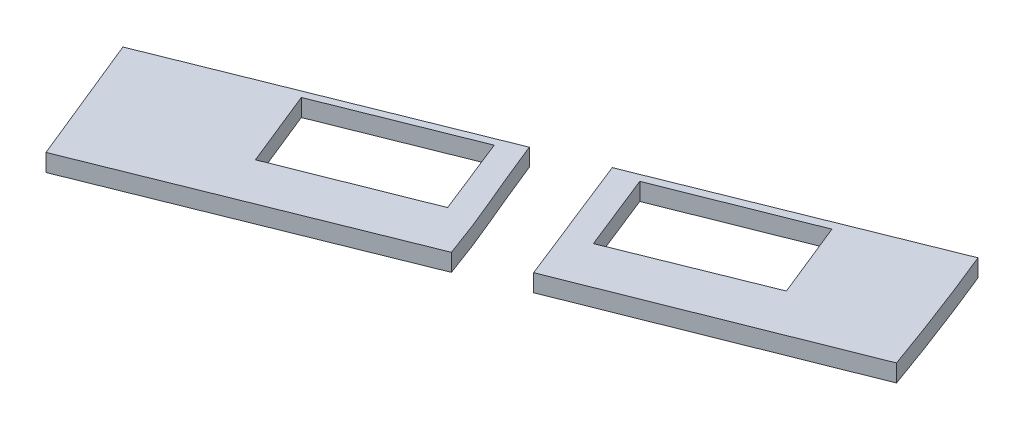
ISO-10303-21;
HEADER;
FILE_DESCRIPTION(('STEP AP214'),'2;1');
FILE_NAME('part.step','',(''),(''),'','','');
FILE_SCHEMA(('AUTOMOTIVE_DESIGN { 1 0 10303 214 1 1 1 1 }'));
ENDSEC;
DATA;
#1=APPLICATION_CONTEXT('core data for automotive mechanical design processes');
#2=APPLICATION_PROTOCOL_DEFINITION('international standard','automotive_design',2000,#1);
#3=PRODUCT_CONTEXT('',#1,'mechanical');
#4=PRODUCT('Part','Part','',(#3));
#5=PRODUCT_RELATED_PRODUCT_CATEGORY('part','',(#4));
#6=PRODUCT_DEFINITION_FORMATION('','',#4);
#7=PRODUCT_DEFINITION_CONTEXT('part definition',#1,'design');
#8=PRODUCT_DEFINITION('design','',#6,#7);
#9=PRODUCT_DEFINITION_SHAPE('','',#8);
#10=(LENGTH_UNIT() NAMED_UNIT(*) SI_UNIT(.MILLI.,.METRE.));
#11=(NAMED_UNIT(*) PLANE_ANGLE_UNIT() SI_UNIT($,.RADIAN.));
#12=(NAMED_UNIT(*) SI_UNIT($,.STERADIAN.) SOLID_ANGLE_UNIT());
#13=UNCERTAINTY_MEASURE_WITH_UNIT(LENGTH_MEASURE(1.E-05),#10,'distance_accuracy_value','');
#14=(GEOMETRIC_REPRESENTATION_CONTEXT(3) GLOBAL_UNCERTAINTY_ASSIGNED_CONTEXT((#13)) GLOBAL_UNIT_ASSIGNED_CONTEXT((#10,
#11,#12)) REPRESENTATION_CONTEXT('',''));
#15=CARTESIAN_POINT('',(0.,0.,0.));
#16=DIRECTION('',(0.,0.,1.));
#17=DIRECTION('',(1.,0.,0.));
#18=AXIS2_PLACEMENT_3D('',#15,#16,#17);
#19=CARTESIAN_POINT('',(35.9788581902602,1.19,-26.9467232131162));
#20=DIRECTION('',(0.,-1.,0.));
#21=DIRECTION('',(0.,0.,-1.));
#22=AXIS2_PLACEMENT_3D('',#19,#20,#21);
#23=PLANE('',#22);
#24=DIRECTION('',(-0.929138932775586,0.,0.369730771779472));
#25=VECTOR('',#24,1.);
#26=CARTESIAN_POINT('',(24.8826001834326,1.19,-16.1536096345668));
#27=LINE('',#26,#25);
#28=CARTESIAN_POINT('',(32.786623966637,1.19,-19.2988451966992));
#29=VERTEX_POINT('',#28);
#30=CARTESIAN_POINT('',(24.8826001834326,1.19,-16.1536096345668));
#31=VERTEX_POINT('',#30);
#32=EDGE_CURVE('E132',#29,#31,#27,.T.);
#33=ORIENTED_EDGE('',*,*,#32,.F.);
#34=DIRECTION('',(-0.374554351369243,0.,-0.927204960011737));
#35=VECTOR('',#34,1.);
#36=CARTESIAN_POINT('',(32.786623966637,1.19,-19.2988451966992));
#37=LINE('',#36,#35);
#38=CARTESIAN_POINT('',(34.559807217706,1.19,-14.9093505895999));
#39=VERTEX_POINT('',#38);
#40=EDGE_CURVE('E206',#39,#29,#37,.T.);
#41=ORIENTED_EDGE('',*,*,#40,.F.);
#42=DIRECTION('',(0.927574779548119,0.,-0.3736375628149));
#43=VECTOR('',#42,1.);
#44=CARTESIAN_POINT('',(34.559807217706,1.19,-14.9093505895999));
#45=LINE('',#44,#43);
#46=CARTESIAN_POINT('',(26.6479258883437,1.19,-11.7223557269067));
#47=VERTEX_POINT('',#46);
#48=EDGE_CURVE('E213',#47,#39,#45,.T.);
#49=ORIENTED_EDGE('',*,*,#48,.F.);
#50=DIRECTION('',(0.370093426325255,0.,0.928994540237365));
#51=VECTOR('',#50,1.);
#52=CARTESIAN_POINT('',(26.6479258883437,1.19,-11.7223557269067));
#53=LINE('',#52,#51);
#54=EDGE_CURVE('E217',#31,#47,#53,.T.);
#55=ORIENTED_EDGE('',*,*,#54,.F.);
#56=EDGE_LOOP('',(#33,#41,#49,#55));
#57=FACE_BOUND('',#56,.T.);
#58=CARTESIAN_POINT('',(41.3064860387741,1.19,-14.4944209133861));
#59=CARTESIAN_POINT('',(40.4413769049084,1.19,-16.9603625473752));
#60=CARTESIAN_POINT('',(38.8653273947854,1.19,-21.0390813626115));
#61=CARTESIAN_POINT('',(38.2178251849978,1.19,-22.5309199781212));
#62=CARTESIAN_POINT('',(37.5641807720796,1.19,-24.0369101682144));
#63=CARTESIAN_POINT('',(36.7438854848778,1.19,-25.4649666392258));
#64=CARTESIAN_POINT('',(35.9992618023672,1.19,-26.9281115543455));
#65=CARTESIAN_POINT('',(35.9910572987333,1.19,-26.9442329564106));
#66=CARTESIAN_POINT('',(35.9659381842422,1.19,-26.9489216293106));
#67=CARTESIAN_POINT('',(35.9606172707881,1.19,-26.9662103934202));
#68=CARTESIAN_POINT('',(35.7688797215146,1.19,-27.5892059164559));
#69=CARTESIAN_POINT('',(35.6349446760462,1.19,-28.230797201937));
#70=CARTESIAN_POINT('',(35.4100442098563,1.19,-28.8426031269095));
#71=CARTESIAN_POINT('',(35.2164658014839,1.19,-29.3692023785491));
#72=CARTESIAN_POINT('',(34.9423080858761,1.19,-29.8625739139352));
#73=CARTESIAN_POINT('',(34.7084400238859,1.19,-30.3725593074478));
#74=B_SPLINE_CURVE_WITH_KNOTS('',3,(#58,#59,#60,#61,#62,#63,#64,#65,#66,#67,#68,#69,#70,#71,#72,
#73),.UNSPECIFIED.,.F.,.F.,(4,3,3,3,3,4),(0.,1.,2.,3.,4.,5.),.UNSPECIFIED.);
#75=CARTESIAN_POINT('',(41.3064860387741,1.19,-14.4944209133861));
#76=VERTEX_POINT('',#75);
#77=CARTESIAN_POINT('',(38.4122924399624,1.19,-22.0724682633881));
#78=VERTEX_POINT('',#77);
#79=EDGE_CURVE('E140',#76,#78,#74,.T.);
#80=ORIENTED_EDGE('',*,*,#79,.T.);
#81=DIRECTION('',(-0.927983740389584,0.,0.372620688599758));
#82=VECTOR('',#81,1.);
#83=CARTESIAN_POINT('',(38.0021800655158,1.19,-21.9077925813591));
#84=LINE('',#83,#82);
#85=CARTESIAN_POINT('',(23.4067210466264,1.19,-16.0471618899583));
#86=VERTEX_POINT('',#85);
#87=EDGE_CURVE('E128',#78,#86,#84,.T.);
#88=ORIENTED_EDGE('',*,*,#87,.T.);
#89=DIRECTION('',(0.36884552030541,0.,0.929490711169634));
#90=VECTOR('',#89,1.);
#91=CARTESIAN_POINT('',(26.3793084328849,1.19,-8.55624167658697));
#92=LINE('',#91,#90);
#93=CARTESIAN_POINT('',(26.3793084328849,1.19,-8.55624167658697));
#94=VERTEX_POINT('',#93);
#95=EDGE_CURVE('E184',#86,#94,#92,.T.);
#96=ORIENTED_EDGE('',*,*,#95,.T.);
#97=DIRECTION('',(0.929176749845426,0.,-0.369635722768635));
#98=VECTOR('',#97,1.);
#99=CARTESIAN_POINT('',(41.3064860387741,1.19,-14.4944209133861));
#100=LINE('',#99,#98);
#101=EDGE_CURVE('E145',#94,#76,#100,.T.);
#102=ORIENTED_EDGE('',*,*,#101,.T.);
#103=EDGE_LOOP('',(#80,#88,#96,#102));
#104=FACE_BOUND('',#103,.T.);
#105=ADVANCED_FACE('F48',(#57,#104),#23,.F.);
#106=CARTESIAN_POINT('',(26.3793084328849,1.19,-8.55624167658697));
#107=DIRECTION('',(0.929490711169634,0.,-0.36884552030541));
#108=DIRECTION('',(-0.36884552030541,0.,-0.929490711169634));
#109=AXIS2_PLACEMENT_3D('',#106,#107,#108);
#110=PLANE('',#109);
#111=DIRECTION('',(0.,-1.,0.));
#112=VECTOR('',#111,1.);
#113=CARTESIAN_POINT('',(23.4067210466264,1.19,-16.0471618899583));
#114=LINE('',#113,#112);
#115=CARTESIAN_POINT('',(23.4067210466264,0.19,-16.0471618899583));
#116=VERTEX_POINT('',#115);
#117=EDGE_CURVE('E135',#86,#116,#114,.T.);
#118=ORIENTED_EDGE('',*,*,#117,.T.);
#119=DIRECTION('',(0.36884552030541,0.,0.929490711169634));
#120=VECTOR('',#119,1.);
#121=CARTESIAN_POINT('',(26.3793084328849,0.19,-8.55624167658697));
#122=LINE('',#121,#120);
#123=CARTESIAN_POINT('',(26.3793084328849,0.19,-8.55624167658697));
#124=VERTEX_POINT('',#123);
#125=EDGE_CURVE('E71',#116,#124,#122,.T.);
#126=ORIENTED_EDGE('',*,*,#125,.T.);
#127=DIRECTION('',(0.,-1.,0.));
#128=VECTOR('',#127,1.);
#129=CARTESIAN_POINT('',(26.3793084328849,1.19,-8.55624167658697));
#130=LINE('',#129,#128);
#131=EDGE_CURVE('E130',#94,#124,#130,.T.);
#132=ORIENTED_EDGE('',*,*,#131,.F.);
#133=ORIENTED_EDGE('',*,*,#95,.F.);
#134=EDGE_LOOP('',(#118,#126,#132,#133));
#135=FACE_BOUND('',#134,.T.);
#136=ADVANCED_FACE('F172',(#135),#110,.F.);
#137=CARTESIAN_POINT('',(41.3064860387741,1.19,-14.4944209133861));
#138=DIRECTION('',(-0.369635722768635,0.,-0.929176749845426));
#139=DIRECTION('',(-0.929176749845426,0.,0.369635722768635));
#140=AXIS2_PLACEMENT_3D('',#137,#138,#139);
#141=PLANE('',#140);
#142=ORIENTED_EDGE('',*,*,#131,.T.);
#143=DIRECTION('',(0.929176749845426,0.,-0.369635722768635));
#144=VECTOR('',#143,1.);
#145=CARTESIAN_POINT('',(41.3064860387741,0.19,-14.4944209133861));
#146=LINE('',#145,#144);
#147=CARTESIAN_POINT('',(41.3064860387741,0.19,-14.4944209133861));
#148=VERTEX_POINT('',#147);
#149=EDGE_CURVE('E124',#124,#148,#146,.T.);
#150=ORIENTED_EDGE('',*,*,#149,.T.);
#151=DIRECTION('',(0.,-1.,0.));
#152=VECTOR('',#151,1.);
#153=CARTESIAN_POINT('',(41.3064860387741,1.19,-14.4944209133861));
#154=LINE('',#153,#152);
#155=EDGE_CURVE('E123',#76,#148,#154,.T.);
#156=ORIENTED_EDGE('',*,*,#155,.F.);
#157=ORIENTED_EDGE('',*,*,#101,.F.);
#158=EDGE_LOOP('',(#142,#150,#156,#157));
#159=FACE_BOUND('',#158,.T.);
#160=ADVANCED_FACE('F155',(#159),#141,.F.);
#161=DIRECTION('',(0.,-1.,0.));
#162=VECTOR('',#161,1.);
#163=SURFACE_OF_LINEAR_EXTRUSION('',#74,#162);
#164=ORIENTED_EDGE('',*,*,#155,.T.);
#165=CARTESIAN_POINT('',(41.3064860387741,0.19,-14.4944209133861));
#166=CARTESIAN_POINT('',(40.4413769049084,0.19,-16.9603625473752));
#167=CARTESIAN_POINT('',(38.8653273947854,0.19,-21.0390813626115));
#168=CARTESIAN_POINT('',(38.2178251849978,0.19,-22.5309199781212));
#169=CARTESIAN_POINT('',(37.5641807720796,0.19,-24.0369101682144));
#170=CARTESIAN_POINT('',(36.7438854848778,0.19,-25.4649666392258));
#171=CARTESIAN_POINT('',(35.9992618023672,0.19,-26.9281115543455));
#172=CARTESIAN_POINT('',(35.9910572987333,0.19,-26.9442329564106));
#173=CARTESIAN_POINT('',(35.9659381842422,0.19,-26.9489216293106));
#174=CARTESIAN_POINT('',(35.9606172707881,0.19,-26.9662103934202));
#175=CARTESIAN_POINT('',(35.7688797215146,0.19,-27.5892059164559));
#176=CARTESIAN_POINT('',(35.6349446760462,0.19,-28.230797201937));
#177=CARTESIAN_POINT('',(35.4100442098563,0.19,-28.8426031269095));
#178=CARTESIAN_POINT('',(35.2164658014839,0.19,-29.3692023785491));
#179=CARTESIAN_POINT('',(34.9423080858761,0.19,-29.8625739139352));
#180=CARTESIAN_POINT('',(34.7084400238859,0.19,-30.3725593074478));
#181=B_SPLINE_CURVE_WITH_KNOTS('',3,(#165,#166,#167,#168,#169,#170,#171,#172,#173,#174,#175,
#176,#177,#178,#179,#180),.UNSPECIFIED.,.F.,.F.,(4,3,3,3,3,4),(0.,1.,2.,3.,4.,5.),.UNSPECIFIED.);
#182=CARTESIAN_POINT('',(38.4122924399589,0.19,-22.0724682633965));
#183=VERTEX_POINT('',#182);
#184=EDGE_CURVE('E111',#148,#183,#181,.T.);
#185=ORIENTED_EDGE('',*,*,#184,.T.);
#186=DIRECTION('',(0.,-1.,0.));
#187=VECTOR('',#186,1.);
#188=CARTESIAN_POINT('',(38.4122924399589,1.19,-22.0724682633965));
#189=LINE('',#188,#187);
#190=EDGE_CURVE('E120',#183,#78,#189,.F.);
#191=ORIENTED_EDGE('',*,*,#190,.T.);
#192=ORIENTED_EDGE('',*,*,#79,.F.);
#193=EDGE_LOOP('',(#164,#185,#191,#192));
#194=FACE_BOUND('',#193,.T.);
#195=ADVANCED_FACE('F118',(#194),#163,.F.);
#196=CARTESIAN_POINT('',(24.8826001834326,1.19,-16.1536096345668));
#197=DIRECTION('',(0.369730771779472,0.,0.929138932775586));
#198=DIRECTION('',(0.929138932775587,0.,-0.369730771779472));
#199=AXIS2_PLACEMENT_3D('',#196,#197,#198);
#200=PLANE('',#199);
#201=DIRECTION('',(-0.929138932775587,0.,0.369730771779472));
#202=VECTOR('',#201,1.);
#203=CARTESIAN_POINT('',(24.8826001834326,0.19,-16.1536096345668));
#204=LINE('',#203,#202);
#205=CARTESIAN_POINT('',(32.786623966637,0.19,-19.2988451966992));
#206=VERTEX_POINT('',#205);
#207=CARTESIAN_POINT('',(24.8826001834326,0.19,-16.1536096345668));
#208=VERTEX_POINT('',#207);
#209=EDGE_CURVE('E125',#206,#208,#204,.T.);
#210=ORIENTED_EDGE('',*,*,#209,.F.);
#211=DIRECTION('',(0.,-1.,0.));
#212=VECTOR('',#211,1.);
#213=CARTESIAN_POINT('',(32.786623966637,1.19,-19.2988451966992));
#214=LINE('',#213,#212);
#215=EDGE_CURVE('E56',#29,#206,#214,.T.);
#216=ORIENTED_EDGE('',*,*,#215,.F.);
#217=ORIENTED_EDGE('',*,*,#32,.T.);
#218=DIRECTION('',(0.,-1.,0.));
#219=VECTOR('',#218,1.);
#220=CARTESIAN_POINT('',(24.8826001834326,1.19,-16.1536096345668));
#221=LINE('',#220,#219);
#222=EDGE_CURVE('E205',#31,#208,#221,.T.);
#223=ORIENTED_EDGE('',*,*,#222,.T.);
#224=EDGE_LOOP('',(#210,#216,#217,#223));
#225=FACE_BOUND('',#224,.T.);
#226=ADVANCED_FACE('F154',(#225),#200,.T.);
#227=CARTESIAN_POINT('',(26.6479258883437,1.19,-11.7223557269067));
#228=DIRECTION('',(0.928994540237365,0.,-0.370093426325255));
#229=DIRECTION('',(-0.370093426325255,0.,-0.928994540237365));
#230=AXIS2_PLACEMENT_3D('',#227,#228,#229);
#231=PLANE('',#230);
#232=DIRECTION('',(0.370093426325255,0.,0.928994540237365));
#233=VECTOR('',#232,1.);
#234=CARTESIAN_POINT('',(26.6479258883437,0.19,-11.7223557269067));
#235=LINE('',#234,#233);
#236=CARTESIAN_POINT('',(26.6479258883437,0.19,-11.7223557269067));
#237=VERTEX_POINT('',#236);
#238=EDGE_CURVE('E194',#208,#237,#235,.T.);
#239=ORIENTED_EDGE('',*,*,#238,.F.);
#240=ORIENTED_EDGE('',*,*,#222,.F.);
#241=ORIENTED_EDGE('',*,*,#54,.T.);
#242=DIRECTION('',(0.,-1.,0.));
#243=VECTOR('',#242,1.);
#244=CARTESIAN_POINT('',(26.6479258883437,1.19,-11.7223557269067));
#245=LINE('',#244,#243);
#246=EDGE_CURVE('E216',#47,#237,#245,.T.);
#247=ORIENTED_EDGE('',*,*,#246,.T.);
#248=EDGE_LOOP('',(#239,#240,#241,#247));
#249=FACE_BOUND('',#248,.T.);
#250=ADVANCED_FACE('F159',(#249),#231,.T.);
#251=CARTESIAN_POINT('',(34.559807217706,1.19,-14.9093505895999));
#252=DIRECTION('',(-0.3736375628149,0.,-0.927574779548119));
#253=DIRECTION('',(-0.927574779548119,0.,0.3736375628149));
#254=AXIS2_PLACEMENT_3D('',#251,#252,#253);
#255=PLANE('',#254);
#256=DIRECTION('',(0.927574779548119,0.,-0.3736375628149));
#257=VECTOR('',#256,1.);
#258=CARTESIAN_POINT('',(34.559807217706,0.19,-14.9093505895999));
#259=LINE('',#258,#257);
#260=CARTESIAN_POINT('',(34.559807217706,0.19,-14.9093505895999));
#261=VERTEX_POINT('',#260);
#262=EDGE_CURVE('E63',#237,#261,#259,.T.);
#263=ORIENTED_EDGE('',*,*,#262,.F.);
#264=ORIENTED_EDGE('',*,*,#246,.F.);
#265=ORIENTED_EDGE('',*,*,#48,.T.);
#266=DIRECTION('',(0.,-1.,0.));
#267=VECTOR('',#266,1.);
#268=CARTESIAN_POINT('',(34.559807217706,1.19,-14.9093505895999));
#269=LINE('',#268,#267);
#270=EDGE_CURVE('E208',#39,#261,#269,.T.);
#271=ORIENTED_EDGE('',*,*,#270,.T.);
#272=EDGE_LOOP('',(#263,#264,#265,#271));
#273=FACE_BOUND('',#272,.T.);
#274=ADVANCED_FACE('F163',(#273),#255,.T.);
#275=CARTESIAN_POINT('',(32.786623966637,1.19,-19.2988451966992));
#276=DIRECTION('',(-0.927204960011737,0.,0.374554351369243));
#277=DIRECTION('',(0.374554351369243,0.,0.927204960011737));
#278=AXIS2_PLACEMENT_3D('',#275,#276,#277);
#279=PLANE('',#278);
#280=DIRECTION('',(-0.374554351369243,0.,-0.927204960011737));
#281=VECTOR('',#280,1.);
#282=CARTESIAN_POINT('',(32.786623966637,0.19,-19.2988451966992));
#283=LINE('',#282,#281);
#284=EDGE_CURVE('E197',#261,#206,#283,.T.);
#285=ORIENTED_EDGE('',*,*,#284,.F.);
#286=ORIENTED_EDGE('',*,*,#270,.F.);
#287=ORIENTED_EDGE('',*,*,#40,.T.);
#288=ORIENTED_EDGE('',*,*,#215,.T.);
#289=EDGE_LOOP('',(#285,#286,#287,#288));
#290=FACE_BOUND('',#289,.T.);
#291=ADVANCED_FACE('F167',(#290),#279,.T.);
#292=CARTESIAN_POINT('',(0.587242746856554,2.54,-6.88427535707816));
#293=DIRECTION('',(0.372620688599758,0.,0.927983740389584));
#294=DIRECTION('',(0.927983740389584,0.,-0.372620688599758));
#295=AXIS2_PLACEMENT_3D('',#292,#293,#294);
#296=PLANE('',#295);
#297=ORIENTED_EDGE('',*,*,#190,.F.);
#298=DIRECTION('',(-0.927983740389584,0.,0.372620688599758));
#299=VECTOR('',#298,1.);
#300=CARTESIAN_POINT('',(0.587242746856554,0.19,-6.88427535707816));
#301=LINE('',#300,#299);
#302=EDGE_CURVE('E12',#183,#116,#301,.T.);
#303=ORIENTED_EDGE('',*,*,#302,.T.);
#304=ORIENTED_EDGE('',*,*,#117,.F.);
#305=ORIENTED_EDGE('',*,*,#87,.F.);
#306=EDGE_LOOP('',(#297,#303,#304,#305));
#307=FACE_BOUND('',#306,.T.);
#308=ADVANCED_FACE('F50',(#307),#296,.F.);
#309=CARTESIAN_POINT('',(7.02322902703717,0.19,1.20618790611286));
#310=DIRECTION('',(0.,1.,0.));
#311=DIRECTION('',(0.,0.,1.));
#312=AXIS2_PLACEMENT_3D('',#309,#310,#311);
#313=PLANE('',#312);
#314=ORIENTED_EDGE('',*,*,#209,.T.);
#315=ORIENTED_EDGE('',*,*,#238,.T.);
#316=ORIENTED_EDGE('',*,*,#262,.T.);
#317=ORIENTED_EDGE('',*,*,#284,.T.);
#318=EDGE_LOOP('',(#314,#315,#316,#317));
#319=FACE_BOUND('',#318,.T.);
#320=ORIENTED_EDGE('',*,*,#302,.F.);
#321=ORIENTED_EDGE('',*,*,#184,.F.);
#322=ORIENTED_EDGE('',*,*,#149,.F.);
#323=ORIENTED_EDGE('',*,*,#125,.F.);
#324=EDGE_LOOP('',(#320,#321,#322,#323));
#325=FACE_BOUND('',#324,.T.);
#326=ADVANCED_FACE('F110',(#319,#325),#313,.F.);
#327=CLOSED_SHELL('',(#105,#136,#160,#195,#226,#250,#274,#291,#308,#326));
#328=MANIFOLD_SOLID_BREP('B2',#327);
#329=CARTESIAN_POINT('',(20.6613006065998,1.19,-9.32441719736461));
#330=DIRECTION('',(-0.369952385002557,0.,-0.929050715962762));
#331=DIRECTION('',(-0.929050715962762,0.,0.369952385002557));
#332=AXIS2_PLACEMENT_3D('',#329,#330,#331);
#333=PLANE('',#332);
#334=DIRECTION('',(0.929050715962762,0.,-0.369952385002557));
#335=VECTOR('',#334,1.);
#336=CARTESIAN_POINT('',(20.6613006065998,0.19,-9.32441719736461));
#337=LINE('',#336,#335);
#338=CARTESIAN_POINT('',(12.7598826331458,0.19,-6.17803522493142));
#339=VERTEX_POINT('',#338);
#340=CARTESIAN_POINT('',(20.6613006065998,0.19,-9.32441719736461));
#341=VERTEX_POINT('',#340);
#342=EDGE_CURVE('E304',#339,#341,#337,.T.);
#343=ORIENTED_EDGE('',*,*,#342,.F.);
#344=DIRECTION('',(0.,-1.,0.));
#345=VECTOR('',#344,1.);
#346=CARTESIAN_POINT('',(12.7598826331458,1.19,-6.17803522493142));
#347=LINE('',#346,#345);
#348=CARTESIAN_POINT('',(12.7598826331458,1.19,-6.17803522493142));
#349=VERTEX_POINT('',#348);
#350=EDGE_CURVE('E407',#349,#339,#347,.T.);
#351=ORIENTED_EDGE('',*,*,#350,.F.);
#352=DIRECTION('',(0.929050715962762,0.,-0.369952385002557));
#353=VECTOR('',#352,1.);
#354=CARTESIAN_POINT('',(20.6613006065998,1.19,-9.32441719736461));
#355=LINE('',#354,#353);
#356=CARTESIAN_POINT('',(20.6613006065998,1.19,-9.32441719736461));
#357=VERTEX_POINT('',#356);
#358=EDGE_CURVE('E392',#349,#357,#355,.T.);
#359=ORIENTED_EDGE('',*,*,#358,.T.);
#360=DIRECTION('',(0.,-1.,0.));
#361=VECTOR('',#360,1.);
#362=CARTESIAN_POINT('',(20.6613006065998,1.19,-9.32441719736461));
#363=LINE('',#362,#361);
#364=EDGE_CURVE('E403',#357,#341,#363,.T.);
#365=ORIENTED_EDGE('',*,*,#364,.T.);
#366=EDGE_LOOP('',(#343,#351,#359,#365));
#367=FACE_BOUND('',#366,.T.);
#368=ADVANCED_FACE('F288',(#367),#333,.T.);
#369=CARTESIAN_POINT('',(12.7598826331458,1.19,-6.17803522493142));
#370=DIRECTION('',(0.927311092131067,0.,-0.374291515280119));
#371=DIRECTION('',(-0.374291515280119,0.,-0.927311092131067));
#372=AXIS2_PLACEMENT_3D('',#369,#370,#371);
#373=PLANE('',#372);
#374=DIRECTION('',(0.374291515280119,0.,0.927311092131067));
#375=VECTOR('',#374,1.);
#376=CARTESIAN_POINT('',(12.7598826331458,0.19,-6.17803522493142));
#377=LINE('',#376,#375);
#378=CARTESIAN_POINT('',(10.9742868291819,0.19,-10.6018672582041));
#379=VERTEX_POINT('',#378);
#380=EDGE_CURVE('E381',#379,#339,#377,.T.);
#381=ORIENTED_EDGE('',*,*,#380,.F.);
#382=DIRECTION('',(0.,-1.,0.));
#383=VECTOR('',#382,1.);
#384=CARTESIAN_POINT('',(10.9742868291819,1.19,-10.6018672582041));
#385=LINE('',#384,#383);
#386=CARTESIAN_POINT('',(10.9742868291819,1.19,-10.6018672582041));
#387=VERTEX_POINT('',#386);
#388=EDGE_CURVE('E411',#387,#379,#385,.T.);
#389=ORIENTED_EDGE('',*,*,#388,.F.);
#390=DIRECTION('',(0.374291515280119,0.,0.927311092131067));
#391=VECTOR('',#390,1.);
#392=CARTESIAN_POINT('',(12.7598826331458,1.19,-6.17803522493142));
#393=LINE('',#392,#391);
#394=EDGE_CURVE('E389',#387,#349,#393,.T.);
#395=ORIENTED_EDGE('',*,*,#394,.T.);
#396=ORIENTED_EDGE('',*,*,#350,.T.);
#397=EDGE_LOOP('',(#381,#389,#395,#396));
#398=FACE_BOUND('',#397,.T.);
#399=ADVANCED_FACE('F447',(#398),#373,.T.);
#400=CARTESIAN_POINT('',(10.9742868291819,1.19,-10.6018672582041));
#401=DIRECTION('',(0.371505502851958,0.,0.928430752049238));
#402=DIRECTION('',(0.928430752049238,0.,-0.371505502851958));
#403=AXIS2_PLACEMENT_3D('',#400,#401,#402);
#404=PLANE('',#403);
#405=DIRECTION('',(-0.928430752049238,0.,0.371505502851958));
#406=VECTOR('',#405,1.);
#407=CARTESIAN_POINT('',(10.9742868291819,0.19,-10.6018672582041));
#408=LINE('',#407,#406);
#409=CARTESIAN_POINT('',(18.8983631390084,0.19,-13.7726346499797));
#410=VERTEX_POINT('',#409);
#411=EDGE_CURVE('E463',#410,#379,#408,.T.);
#412=ORIENTED_EDGE('',*,*,#411,.F.);
#413=DIRECTION('',(0.,-1.,0.));
#414=VECTOR('',#413,1.);
#415=CARTESIAN_POINT('',(18.8983631390084,1.19,-13.7726346499797));
#416=LINE('',#415,#414);
#417=CARTESIAN_POINT('',(18.8983631390084,1.19,-13.7726346499797));
#418=VERTEX_POINT('',#417);
#419=EDGE_CURVE('E399',#418,#410,#416,.T.);
#420=ORIENTED_EDGE('',*,*,#419,.F.);
#421=DIRECTION('',(-0.928430752049238,0.,0.371505502851958));
#422=VECTOR('',#421,1.);
#423=CARTESIAN_POINT('',(10.9742868291819,1.19,-10.6018672582041));
#424=LINE('',#423,#422);
#425=EDGE_CURVE('E386',#418,#387,#424,.T.);
#426=ORIENTED_EDGE('',*,*,#425,.T.);
#427=ORIENTED_EDGE('',*,*,#388,.T.);
#428=EDGE_LOOP('',(#412,#420,#426,#427));
#429=FACE_BOUND('',#428,.T.);
#430=ADVANCED_FACE('F443',(#429),#404,.T.);
#431=CARTESIAN_POINT('',(18.8983631390084,1.19,-13.7726346499797));
#432=DIRECTION('',(-0.929650276343834,0.,0.368443162094009));
#433=DIRECTION('',(0.368443162094009,0.,0.929650276343834));
#434=AXIS2_PLACEMENT_3D('',#431,#432,#433);
#435=PLANE('',#434);
#436=DIRECTION('',(-0.368443162094009,0.,-0.929650276343834));
#437=VECTOR('',#436,1.);
#438=CARTESIAN_POINT('',(18.8983631390084,0.19,-13.7726346499797));
#439=LINE('',#438,#437);
#440=EDGE_CURVE('E468',#341,#410,#439,.T.);
#441=ORIENTED_EDGE('',*,*,#440,.F.);
#442=ORIENTED_EDGE('',*,*,#364,.F.);
#443=DIRECTION('',(-0.368443162094009,0.,-0.929650276343834));
#444=VECTOR('',#443,1.);
#445=CARTESIAN_POINT('',(18.8983631390084,1.19,-13.7726346499797));
#446=LINE('',#445,#444);
#447=EDGE_CURVE('E396',#357,#418,#446,.T.);
#448=ORIENTED_EDGE('',*,*,#447,.T.);
#449=ORIENTED_EDGE('',*,*,#419,.T.);
#450=EDGE_LOOP('',(#441,#442,#448,#449));
#451=FACE_BOUND('',#450,.T.);
#452=ADVANCED_FACE('F436',(#451),#435,.T.);
#453=CARTESIAN_POINT('',(22.9999228700686,1.19,-7.20708420605326));
#454=DIRECTION('',(-0.372885292104658,0.,-0.927877448229034));
#455=DIRECTION('',(-0.927877448229034,0.,0.372885292104658));
#456=AXIS2_PLACEMENT_3D('',#453,#454,#455);
#457=PLANE('',#456);
#458=DIRECTION('',(0.,-1.,0.));
#459=VECTOR('',#458,1.);
#460=CARTESIAN_POINT('',(6.37170948359056,1.19,-0.524718751833313));
#461=LINE('',#460,#459);
#462=CARTESIAN_POINT('',(6.37170948359056,1.19,-0.524718751833313));
#463=VERTEX_POINT('',#462);
#464=CARTESIAN_POINT('',(6.37170948359056,0.19,-0.524718751833313));
#465=VERTEX_POINT('',#464);
#466=EDGE_CURVE('E46',#463,#465,#461,.T.);
#467=ORIENTED_EDGE('',*,*,#466,.T.);
#468=DIRECTION('',(0.927877448229034,0.,-0.372885292104658));
#469=VECTOR('',#468,1.);
#470=CARTESIAN_POINT('',(22.9999228700686,0.19,-7.20708420605326));
#471=LINE('',#470,#469);
#472=CARTESIAN_POINT('',(22.9999228700686,0.19,-7.20708420605326));
#473=VERTEX_POINT('',#472);
#474=EDGE_CURVE('E369',#465,#473,#471,.T.);
#475=ORIENTED_EDGE('',*,*,#474,.T.);
#476=DIRECTION('',(0.,-1.,0.));
#477=VECTOR('',#476,1.);
#478=CARTESIAN_POINT('',(22.9999228700686,1.19,-7.20708420605326));
#479=LINE('',#478,#477);
#480=CARTESIAN_POINT('',(22.9999228700686,1.19,-7.20708420605326));
#481=VERTEX_POINT('',#480);
#482=EDGE_CURVE('E297',#481,#473,#479,.T.);
#483=ORIENTED_EDGE('',*,*,#482,.F.);
#484=DIRECTION('',(0.927877448229034,0.,-0.372885292104658));
#485=VECTOR('',#484,1.);
#486=CARTESIAN_POINT('',(22.9999228700686,1.19,-7.20708420605326));
#487=LINE('',#486,#485);
#488=EDGE_CURVE('E418',#463,#481,#487,.T.);
#489=ORIENTED_EDGE('',*,*,#488,.F.);
#490=EDGE_LOOP('',(#467,#475,#483,#489));
#491=FACE_BOUND('',#490,.T.);
#492=ADVANCED_FACE('F434',(#491),#457,.F.);
#493=CARTESIAN_POINT('',(6.37170948359056,1.19,-0.524718751833313));
#494=DIRECTION('',(0.926104977581924,0.,-0.377265914837246));
#495=DIRECTION('',(-0.377265914837246,0.,-0.926104977581924));
#496=AXIS2_PLACEMENT_3D('',#493,#494,#495);
#497=PLANE('',#496);
#498=DIRECTION('',(0.,-1.,0.));
#499=VECTOR('',#498,1.);
#500=CARTESIAN_POINT('',(3.33204848576796,1.19,-7.98641902618638));
#501=LINE('',#500,#499);
#502=CARTESIAN_POINT('',(3.33204848576796,1.19,-7.98641902618638));
#503=VERTEX_POINT('',#502);
#504=CARTESIAN_POINT('',(3.33204848576796,0.19,-7.98641902618638));
#505=VERTEX_POINT('',#504);
#506=EDGE_CURVE('E379',#503,#505,#501,.T.);
#507=ORIENTED_EDGE('',*,*,#506,.T.);
#508=DIRECTION('',(0.377265914837246,0.,0.926104977581924));
#509=VECTOR('',#508,1.);
#510=CARTESIAN_POINT('',(6.37170948359056,0.19,-0.524718751833313));
#511=LINE('',#510,#509);
#512=EDGE_CURVE('E312',#505,#465,#511,.T.);
#513=ORIENTED_EDGE('',*,*,#512,.T.);
#514=ORIENTED_EDGE('',*,*,#466,.F.);
#515=DIRECTION('',(0.377265914837246,0.,0.926104977581924));
#516=VECTOR('',#515,1.);
#517=CARTESIAN_POINT('',(6.37170948359056,1.19,-0.524718751833313));
#518=LINE('',#517,#516);
#519=EDGE_CURVE('E415',#503,#463,#518,.T.);
#520=ORIENTED_EDGE('',*,*,#519,.F.);
#521=EDGE_LOOP('',(#507,#513,#514,#520));
#522=FACE_BOUND('',#521,.T.);
#523=ADVANCED_FACE('F290',(#522),#497,.F.);
#524=CARTESIAN_POINT('',(22.9999228700686,1.19,-7.20708420605326));
#525=CARTESIAN_POINT('',(22.0115475346655,1.19,-9.98661151399347));
#526=CARTESIAN_POINT('',(21.5188945967217,1.19,-10.8820647279259));
#527=CARTESIAN_POINT('',(20.0021583951109,1.19,-14.686998305048));
#528=CARTESIAN_POINT('',(19.3466827716481,1.19,-16.3313456912646));
#529=CARTESIAN_POINT('',(19.1275109478908,1.19,-16.988826809381));
#530=CARTESIAN_POINT('',(18.2342460124436,1.19,-19.0982296967628));
#531=CARTESIAN_POINT('',(18.0311634837373,1.19,-19.5777994810791));
#532=CARTESIAN_POINT('',(17.4655783405814,1.19,-19.6171123035761));
#533=CARTESIAN_POINT('',(17.1976734702197,1.19,-20.0183884446883));
#534=CARTESIAN_POINT('',(17.0440445021911,1.19,-20.2484986303312));
#535=CARTESIAN_POINT('',(16.8068058528764,1.19,-20.4410440927477));
#536=CARTESIAN_POINT('',(16.7367865661339,1.19,-20.708719001617));
#537=CARTESIAN_POINT('',(16.6637645790077,1.19,-20.9878728556309));
#538=CARTESIAN_POINT('',(16.617400623009,1.19,-21.2735503084374));
#539=CARTESIAN_POINT('',(16.5443786358828,1.19,-21.5527041624513));
#540=CARTESIAN_POINT('',(16.5398013319158,1.19,-21.5702026186516));
#541=CARTESIAN_POINT('',(16.5187823531704,1.19,-21.5782662639945));
#542=CARTESIAN_POINT('',(16.5059842118141,1.19,-21.5910473147661));
#543=B_SPLINE_CURVE_WITH_KNOTS('',3,(#524,#525,#526,#527,#528,#529,#530,#531,#532,#533,#534,
#535,#536,#537,#538,#539,#540,#541,#542),.UNSPECIFIED.,.F.,.F.,(4,3,3,3,3,3,4),(0.,1.,2.,3.,4.,
5.,6.),.UNSPECIFIED.);
#544=DIRECTION('',(0.,-1.,0.));
#545=VECTOR('',#544,1.);
#546=SURFACE_OF_LINEAR_EXTRUSION('',#543,#545);
#547=ORIENTED_EDGE('',*,*,#482,.T.);
#548=CARTESIAN_POINT('',(22.9999228700686,0.19,-7.20708420605326));
#549=CARTESIAN_POINT('',(22.0115475346655,0.19,-9.98661151399347));
#550=CARTESIAN_POINT('',(21.5188945967217,0.19,-10.8820647279259));
#551=CARTESIAN_POINT('',(20.0021583951109,0.19,-14.686998305048));
#552=CARTESIAN_POINT('',(19.3466827716481,0.19,-16.3313456912646));
#553=CARTESIAN_POINT('',(19.1275109478908,0.19,-16.988826809381));
#554=CARTESIAN_POINT('',(18.2342460124436,0.19,-19.0982296967628));
#555=CARTESIAN_POINT('',(18.0311634837373,0.19,-19.5777994810791));
#556=CARTESIAN_POINT('',(17.4655783405814,0.19,-19.6171123035761));
#557=CARTESIAN_POINT('',(17.1976734702197,0.19,-20.0183884446883));
#558=CARTESIAN_POINT('',(17.0440445021911,0.19,-20.2484986303312));
#559=CARTESIAN_POINT('',(16.8068058528764,0.19,-20.4410440927477));
#560=CARTESIAN_POINT('',(16.7367865661339,0.19,-20.708719001617));
#561=CARTESIAN_POINT('',(16.6637645790077,0.19,-20.9878728556309));
#562=CARTESIAN_POINT('',(16.617400623009,0.19,-21.2735503084374));
#563=CARTESIAN_POINT('',(16.5443786358828,0.19,-21.5527041624513));
#564=CARTESIAN_POINT('',(16.5398013319158,0.19,-21.5702026186516));
#565=CARTESIAN_POINT('',(16.5187823531704,0.19,-21.5782662639945));
#566=CARTESIAN_POINT('',(16.5059842118141,0.19,-21.5910473147661));
#567=B_SPLINE_CURVE_WITH_KNOTS('',3,(#548,#549,#550,#551,#552,#553,#554,#555,#556,#557,#558,
#559,#560,#561,#562,#563,#564,#565,#566),.UNSPECIFIED.,.F.,.F.,(4,3,3,3,3,3,4),(0.,1.,2.,3.,4.,
5.,6.),.UNSPECIFIED.);
#568=CARTESIAN_POINT('',(20.0045286341788,0.19,-14.681052523707));
#569=VERTEX_POINT('',#568);
#570=EDGE_CURVE('E354',#473,#569,#567,.T.);
#571=ORIENTED_EDGE('',*,*,#570,.T.);
#572=DIRECTION('',(0.,-1.,0.));
#573=VECTOR('',#572,1.);
#574=CARTESIAN_POINT('',(20.0045286341788,1.19,-14.681052523707));
#575=LINE('',#574,#573);
#576=CARTESIAN_POINT('',(20.0045286341788,1.19,-14.681052523707));
#577=VERTEX_POINT('',#576);
#578=EDGE_CURVE('E365',#569,#577,#575,.F.);
#579=ORIENTED_EDGE('',*,*,#578,.T.);
#580=EDGE_CURVE('E421',#481,#577,#543,.T.);
#581=ORIENTED_EDGE('',*,*,#580,.F.);
#582=EDGE_LOOP('',(#547,#571,#579,#581));
#583=FACE_BOUND('',#582,.T.);
#584=ADVANCED_FACE('F363',(#583),#546,.F.);
#585=CARTESIAN_POINT('',(35.9788581902602,1.19,-26.9467232131162));
#586=DIRECTION('',(0.,-1.,0.));
#587=DIRECTION('',(0.,0.,-1.));
#588=AXIS2_PLACEMENT_3D('',#585,#586,#587);
#589=PLANE('',#588);
#590=ORIENTED_EDGE('',*,*,#580,.T.);
#591=DIRECTION('',(-0.927983740389584,0.,0.372620688599758));
#592=VECTOR('',#591,1.);
#593=CARTESIAN_POINT('',(38.0021800655158,1.19,-21.9077925813591));
#594=LINE('',#593,#592);
#595=EDGE_CURVE('E373',#577,#503,#594,.T.);
#596=ORIENTED_EDGE('',*,*,#595,.T.);
#597=ORIENTED_EDGE('',*,*,#519,.T.);
#598=ORIENTED_EDGE('',*,*,#488,.T.);
#599=EDGE_LOOP('',(#590,#596,#597,#598));
#600=FACE_BOUND('',#599,.T.);
#601=ORIENTED_EDGE('',*,*,#425,.F.);
#602=ORIENTED_EDGE('',*,*,#447,.F.);
#603=ORIENTED_EDGE('',*,*,#358,.F.);
#604=ORIENTED_EDGE('',*,*,#394,.F.);
#605=EDGE_LOOP('',(#601,#602,#603,#604));
#606=FACE_BOUND('',#605,.T.);
#607=ADVANCED_FACE('F432',(#600,#606),#589,.F.);
#608=CARTESIAN_POINT('',(0.587242746856554,2.54,-6.88427535707816));
#609=DIRECTION('',(0.372620688599758,0.,0.927983740389584));
#610=DIRECTION('',(0.927983740389584,0.,-0.372620688599758));
#611=AXIS2_PLACEMENT_3D('',#608,#609,#610);
#612=PLANE('',#611);
#613=ORIENTED_EDGE('',*,*,#578,.F.);
#614=DIRECTION('',(0.927983740389584,0.,-0.372620688599758));
#615=VECTOR('',#614,1.);
#616=CARTESIAN_POINT('',(3.33204848576796,0.19,-7.98641902618637));
#617=LINE('',#616,#615);
#618=EDGE_CURVE('E351',#505,#569,#617,.T.);
#619=ORIENTED_EDGE('',*,*,#618,.F.);
#620=ORIENTED_EDGE('',*,*,#506,.F.);
#621=ORIENTED_EDGE('',*,*,#595,.F.);
#622=EDGE_LOOP('',(#613,#619,#620,#621));
#623=FACE_BOUND('',#622,.T.);
#624=ADVANCED_FACE('F371',(#623),#612,.F.);
#625=CARTESIAN_POINT('',(7.02322902703717,0.19,1.20618790611286));
#626=DIRECTION('',(0.,1.,0.));
#627=DIRECTION('',(0.,0.,1.));
#628=AXIS2_PLACEMENT_3D('',#625,#626,#627);
#629=PLANE('',#628);
#630=ORIENTED_EDGE('',*,*,#342,.T.);
#631=ORIENTED_EDGE('',*,*,#440,.T.);
#632=ORIENTED_EDGE('',*,*,#411,.T.);
#633=ORIENTED_EDGE('',*,*,#380,.T.);
#634=EDGE_LOOP('',(#630,#631,#632,#633));
#635=FACE_BOUND('',#634,.T.);
#636=ORIENTED_EDGE('',*,*,#618,.T.);
#637=ORIENTED_EDGE('',*,*,#570,.F.);
#638=ORIENTED_EDGE('',*,*,#474,.F.);
#639=ORIENTED_EDGE('',*,*,#512,.F.);
#640=EDGE_LOOP('',(#636,#637,#638,#639));
#641=FACE_BOUND('',#640,.T.);
#642=ADVANCED_FACE('F353',(#635,#641),#629,.F.);
#643=CLOSED_SHELL('',(#368,#399,#430,#452,#492,#523,#584,#607,#624,#642));
#644=MANIFOLD_SOLID_BREP('B6',#643);
#645=ADVANCED_BREP_SHAPE_REPRESENTATION('',(#18,#328,#644),#14);
#646=SHAPE_DEFINITION_REPRESENTATION(#9,#645);
ENDSEC;
END-ISO-10303-21;
